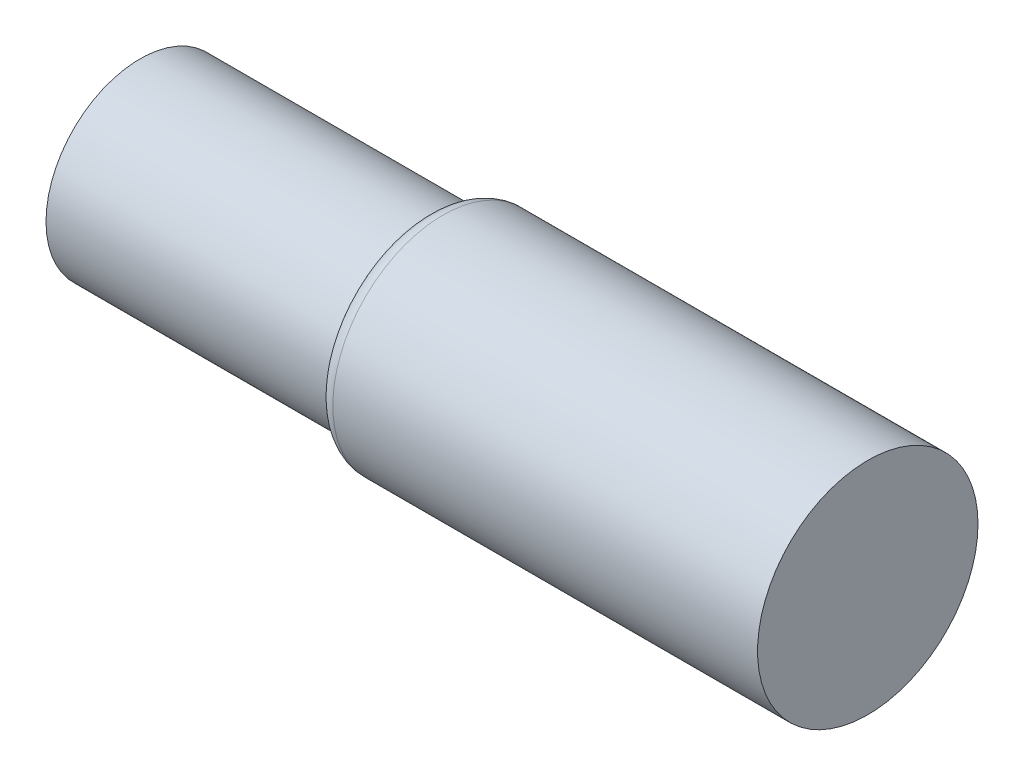
ISO-10303-21;
HEADER;
FILE_DESCRIPTION(('STEP AP214'),'2;1');
FILE_NAME('part.step','',(''),(''),'','','');
FILE_SCHEMA(('AUTOMOTIVE_DESIGN { 1 0 10303 214 1 1 1 1 }'));
ENDSEC;
DATA;
#1=APPLICATION_CONTEXT('core data for automotive mechanical design processes');
#2=APPLICATION_PROTOCOL_DEFINITION('international standard','automotive_design',2000,#1);
#3=PRODUCT_CONTEXT('',#1,'mechanical');
#4=PRODUCT('Part','Part','',(#3));
#5=PRODUCT_RELATED_PRODUCT_CATEGORY('part','',(#4));
#6=PRODUCT_DEFINITION_FORMATION('','',#4);
#7=PRODUCT_DEFINITION_CONTEXT('part definition',#1,'design');
#8=PRODUCT_DEFINITION('design','',#6,#7);
#9=PRODUCT_DEFINITION_SHAPE('','',#8);
#10=(LENGTH_UNIT() NAMED_UNIT(*) SI_UNIT(.MILLI.,.METRE.));
#11=(NAMED_UNIT(*) PLANE_ANGLE_UNIT() SI_UNIT($,.RADIAN.));
#12=(NAMED_UNIT(*) SI_UNIT($,.STERADIAN.) SOLID_ANGLE_UNIT());
#13=UNCERTAINTY_MEASURE_WITH_UNIT(LENGTH_MEASURE(1.E-05),#10,'distance_accuracy_value','');
#14=(GEOMETRIC_REPRESENTATION_CONTEXT(3) GLOBAL_UNCERTAINTY_ASSIGNED_CONTEXT((#13)) GLOBAL_UNIT_ASSIGNED_CONTEXT((#10,
#11,#12)) REPRESENTATION_CONTEXT('',''));
#15=CARTESIAN_POINT('',(0.,0.,0.));
#16=DIRECTION('',(0.,0.,1.));
#17=DIRECTION('',(1.,0.,0.));
#18=AXIS2_PLACEMENT_3D('',#15,#16,#17);
#19=CARTESIAN_POINT('',(48.8,0.,0.));
#20=DIRECTION('',(-1.,0.,0.));
#21=DIRECTION('',(0.,0.,1.));
#22=AXIS2_PLACEMENT_3D('',#19,#20,#21);
#23=CYLINDRICAL_SURFACE('',#22,16.);
#24=CARTESIAN_POINT('',(48.8,0.,0.));
#25=DIRECTION('',(1.,0.,0.));
#26=DIRECTION('',(0.,0.,-1.));
#27=AXIS2_PLACEMENT_3D('',#24,#25,#26);
#28=CIRCLE('',#27,16.);
#29=CARTESIAN_POINT('',(48.8,0.,-16.));
#30=VERTEX_POINT('',#29);
#31=EDGE_CURVE('E45',#30,#30,#28,.T.);
#32=ORIENTED_EDGE('',*,*,#31,.F.);
#33=EDGE_LOOP('',(#32));
#34=FACE_BOUND('',#33,.T.);
#35=CARTESIAN_POINT('',(0.,0.,0.));
#36=DIRECTION('',(1.,0.,0.));
#37=DIRECTION('',(0.,0.,-1.));
#38=AXIS2_PLACEMENT_3D('',#35,#36,#37);
#39=CIRCLE('',#38,16.);
#40=CARTESIAN_POINT('',(0.,0.,-16.));
#41=VERTEX_POINT('',#40);
#42=EDGE_CURVE('E49',#41,#41,#39,.T.);
#43=ORIENTED_EDGE('',*,*,#42,.T.);
#44=EDGE_LOOP('',(#43));
#45=FACE_BOUND('',#44,.T.);
#46=ADVANCED_FACE('F34',(#34,#45),#23,.T.);
#47=CARTESIAN_POINT('',(0.,0.,0.));
#48=DIRECTION('',(1.,0.,0.));
#49=DIRECTION('',(0.,0.,-1.));
#50=AXIS2_PLACEMENT_3D('',#47,#48,#49);
#51=PLANE('',#50);
#52=CARTESIAN_POINT('',(0.,-8.,-8.));
#53=DIRECTION('',(-1.,0.,0.));
#54=DIRECTION('',(0.,0.,-1.));
#55=AXIS2_PLACEMENT_3D('',#52,#53,#54);
#56=CIRCLE('',#55,2.);
#57=CARTESIAN_POINT('',(0.,-8.,-10.));
#58=VERTEX_POINT('',#57);
#59=EDGE_CURVE('E70',#58,#58,#56,.T.);
#60=ORIENTED_EDGE('',*,*,#59,.F.);
#61=EDGE_LOOP('',(#60));
#62=FACE_BOUND('',#61,.T.);
#63=CARTESIAN_POINT('',(0.,-8.,8.));
#64=DIRECTION('',(-1.,0.,0.));
#65=DIRECTION('',(0.,0.,1.));
#66=AXIS2_PLACEMENT_3D('',#63,#64,#65);
#67=CIRCLE('',#66,2.);
#68=CARTESIAN_POINT('',(0.,-8.,10.));
#69=VERTEX_POINT('',#68);
#70=EDGE_CURVE('E76',#69,#69,#67,.T.);
#71=ORIENTED_EDGE('',*,*,#70,.F.);
#72=EDGE_LOOP('',(#71));
#73=FACE_BOUND('',#72,.T.);
#74=CARTESIAN_POINT('',(0.,8.,8.));
#75=DIRECTION('',(-1.,0.,0.));
#76=DIRECTION('',(0.,0.,-1.));
#77=AXIS2_PLACEMENT_3D('',#74,#75,#76);
#78=CIRCLE('',#77,2.);
#79=CARTESIAN_POINT('',(0.,8.,6.));
#80=VERTEX_POINT('',#79);
#81=EDGE_CURVE('E82',#80,#80,#78,.T.);
#82=ORIENTED_EDGE('',*,*,#81,.F.);
#83=EDGE_LOOP('',(#82));
#84=FACE_BOUND('',#83,.T.);
#85=CARTESIAN_POINT('',(0.,8.,-8.));
#86=DIRECTION('',(-1.,0.,0.));
#87=DIRECTION('',(0.,0.,1.));
#88=AXIS2_PLACEMENT_3D('',#85,#86,#87);
#89=CIRCLE('',#88,2.);
#90=CARTESIAN_POINT('',(0.,8.,-6.));
#91=VERTEX_POINT('',#90);
#92=EDGE_CURVE('E64',#91,#91,#89,.T.);
#93=ORIENTED_EDGE('',*,*,#92,.F.);
#94=EDGE_LOOP('',(#93));
#95=FACE_BOUND('',#94,.T.);
#96=CARTESIAN_POINT('',(0.,0.,0.));
#97=DIRECTION('',(-1.,0.,0.));
#98=DIRECTION('',(0.,0.,1.));
#99=AXIS2_PLACEMENT_3D('',#96,#97,#98);
#100=CIRCLE('',#99,3.);
#101=CARTESIAN_POINT('',(0.,0.,3.));
#102=VERTEX_POINT('',#101);
#103=EDGE_CURVE('E58',#102,#102,#100,.T.);
#104=ORIENTED_EDGE('',*,*,#103,.F.);
#105=EDGE_LOOP('',(#104));
#106=FACE_BOUND('',#105,.T.);
#107=ORIENTED_EDGE('',*,*,#42,.F.);
#108=EDGE_LOOP('',(#107));
#109=FACE_BOUND('',#108,.T.);
#110=ADVANCED_FACE('F97',(#62,#73,#84,#95,#106,#109),#51,.F.);
#111=CARTESIAN_POINT('',(123.8,0.,0.));
#112=DIRECTION('',(-1.,0.,0.));
#113=DIRECTION('',(0.,0.,1.));
#114=AXIS2_PLACEMENT_3D('',#111,#112,#113);
#115=CYLINDRICAL_SURFACE('',#114,18.75);
#116=CARTESIAN_POINT('',(51.54,0.,0.));
#117=DIRECTION('',(1.,0.,0.));
#118=DIRECTION('',(0.,0.,-1.));
#119=AXIS2_PLACEMENT_3D('',#116,#117,#118);
#120=CIRCLE('',#119,18.75);
#121=CARTESIAN_POINT('',(51.54,0.,-18.75));
#122=VERTEX_POINT('',#121);
#123=EDGE_CURVE('E41',#122,#122,#120,.T.);
#124=ORIENTED_EDGE('',*,*,#123,.T.);
#125=EDGE_LOOP('',(#124));
#126=FACE_BOUND('',#125,.T.);
#127=CARTESIAN_POINT('',(123.8,0.,0.));
#128=DIRECTION('',(1.,0.,0.));
#129=DIRECTION('',(0.,0.,-1.));
#130=AXIS2_PLACEMENT_3D('',#127,#128,#129);
#131=CIRCLE('',#130,18.75);
#132=CARTESIAN_POINT('',(123.8,0.,-18.75));
#133=VERTEX_POINT('',#132);
#134=EDGE_CURVE('E53',#133,#133,#131,.T.);
#135=ORIENTED_EDGE('',*,*,#134,.F.);
#136=EDGE_LOOP('',(#135));
#137=FACE_BOUND('',#136,.T.);
#138=ADVANCED_FACE('F100',(#126,#137),#115,.T.);
#139=CARTESIAN_POINT('',(123.8,0.,0.));
#140=DIRECTION('',(1.,0.,0.));
#141=DIRECTION('',(0.,0.,-1.));
#142=AXIS2_PLACEMENT_3D('',#139,#140,#141);
#143=PLANE('',#142);
#144=ORIENTED_EDGE('',*,*,#134,.T.);
#145=EDGE_LOOP('',(#144));
#146=FACE_BOUND('',#145,.T.);
#147=ADVANCED_FACE('F117',(#146),#143,.T.);
#148=CARTESIAN_POINT('',(48.8,0.,0.));
#149=DIRECTION('',(1.,0.,0.));
#150=DIRECTION('',(0.,0.,-1.));
#151=AXIS2_PLACEMENT_3D('',#148,#149,#150);
#152=PLANE('',#151);
#153=CARTESIAN_POINT('',(48.8,0.,0.));
#154=DIRECTION('',(1.,0.,0.));
#155=DIRECTION('',(0.,0.,-1.));
#156=AXIS2_PLACEMENT_3D('',#153,#154,#155);
#157=CIRCLE('',#156,16.01);
#158=CARTESIAN_POINT('',(48.8,0.,-16.01));
#159=VERTEX_POINT('',#158);
#160=EDGE_CURVE('E10',#159,#159,#157,.F.);
#161=ORIENTED_EDGE('',*,*,#160,.T.);
#162=EDGE_LOOP('',(#161));
#163=FACE_BOUND('',#162,.T.);
#164=ORIENTED_EDGE('',*,*,#31,.T.);
#165=EDGE_LOOP('',(#164));
#166=FACE_BOUND('',#165,.T.);
#167=ADVANCED_FACE('F118',(#163,#166),#152,.F.);
#168=CARTESIAN_POINT('',(51.54,0.,0.));
#169=DIRECTION('',(1.,0.,0.));
#170=DIRECTION('',(0.,0.,-1.));
#171=AXIS2_PLACEMENT_3D('',#168,#169,#170);
#172=TOROIDAL_SURFACE('',#171,16.01,2.74);
#173=ORIENTED_EDGE('',*,*,#160,.F.);
#174=EDGE_LOOP('',(#173));
#175=FACE_BOUND('',#174,.T.);
#176=ORIENTED_EDGE('',*,*,#123,.F.);
#177=EDGE_LOOP('',(#176));
#178=FACE_BOUND('',#177,.T.);
#179=ADVANCED_FACE('F36',(#175,#178),#172,.T.);
#180=CARTESIAN_POINT('',(2.,0.,0.));
#181=DIRECTION('',(-1.,0.,0.));
#182=DIRECTION('',(0.,0.,1.));
#183=AXIS2_PLACEMENT_3D('',#180,#181,#182);
#184=CYLINDRICAL_SURFACE('',#183,3.);
#185=CARTESIAN_POINT('',(2.,0.,0.));
#186=DIRECTION('',(-1.,0.,0.));
#187=DIRECTION('',(0.,0.,1.));
#188=AXIS2_PLACEMENT_3D('',#185,#186,#187);
#189=CIRCLE('',#188,3.);
#190=CARTESIAN_POINT('',(2.,0.,3.));
#191=VERTEX_POINT('',#190);
#192=EDGE_CURVE('E57',#191,#191,#189,.T.);
#193=ORIENTED_EDGE('',*,*,#192,.F.);
#194=EDGE_LOOP('',(#193));
#195=FACE_BOUND('',#194,.T.);
#196=ORIENTED_EDGE('',*,*,#103,.T.);
#197=EDGE_LOOP('',(#196));
#198=FACE_BOUND('',#197,.T.);
#199=ADVANCED_FACE('F124',(#195,#198),#184,.F.);
#200=CARTESIAN_POINT('',(2.,0.,0.));
#201=DIRECTION('',(-1.,0.,0.));
#202=DIRECTION('',(0.,0.,1.));
#203=AXIS2_PLACEMENT_3D('',#200,#201,#202);
#204=PLANE('',#203);
#205=ORIENTED_EDGE('',*,*,#192,.T.);
#206=EDGE_LOOP('',(#205));
#207=FACE_BOUND('',#206,.T.);
#208=ADVANCED_FACE('F127',(#207),#204,.T.);
#209=CARTESIAN_POINT('',(10.,8.,-8.));
#210=DIRECTION('',(-1.,0.,0.));
#211=DIRECTION('',(0.,0.,1.));
#212=AXIS2_PLACEMENT_3D('',#209,#210,#211);
#213=CYLINDRICAL_SURFACE('',#212,2.);
#214=CARTESIAN_POINT('',(10.,8.,-8.));
#215=DIRECTION('',(-1.,0.,0.));
#216=DIRECTION('',(0.,0.,1.));
#217=AXIS2_PLACEMENT_3D('',#214,#215,#216);
#218=CIRCLE('',#217,2.);
#219=CARTESIAN_POINT('',(10.,8.,-6.));
#220=VERTEX_POINT('',#219);
#221=EDGE_CURVE('E61',#220,#220,#218,.T.);
#222=ORIENTED_EDGE('',*,*,#221,.F.);
#223=EDGE_LOOP('',(#222));
#224=FACE_BOUND('',#223,.T.);
#225=ORIENTED_EDGE('',*,*,#92,.T.);
#226=EDGE_LOOP('',(#225));
#227=FACE_BOUND('',#226,.T.);
#228=ADVANCED_FACE('F131',(#224,#227),#213,.F.);
#229=CARTESIAN_POINT('',(10.,8.,-8.));
#230=DIRECTION('',(-1.,0.,0.));
#231=DIRECTION('',(0.,0.,1.));
#232=AXIS2_PLACEMENT_3D('',#229,#230,#231);
#233=PLANE('',#232);
#234=ORIENTED_EDGE('',*,*,#221,.T.);
#235=EDGE_LOOP('',(#234));
#236=FACE_BOUND('',#235,.T.);
#237=ADVANCED_FACE('F93',(#236),#233,.T.);
#238=CARTESIAN_POINT('',(10.,8.,8.));
#239=DIRECTION('',(-1.,0.,0.));
#240=DIRECTION('',(0.,0.,1.));
#241=AXIS2_PLACEMENT_3D('',#238,#239,#240);
#242=CYLINDRICAL_SURFACE('',#241,2.);
#243=CARTESIAN_POINT('',(10.,8.,8.));
#244=DIRECTION('',(-1.,0.,0.));
#245=DIRECTION('',(0.,0.,-1.));
#246=AXIS2_PLACEMENT_3D('',#243,#244,#245);
#247=CIRCLE('',#246,2.);
#248=CARTESIAN_POINT('',(10.,8.,6.));
#249=VERTEX_POINT('',#248);
#250=EDGE_CURVE('E67',#249,#249,#247,.T.);
#251=ORIENTED_EDGE('',*,*,#250,.F.);
#252=EDGE_LOOP('',(#251));
#253=FACE_BOUND('',#252,.T.);
#254=ORIENTED_EDGE('',*,*,#81,.T.);
#255=EDGE_LOOP('',(#254));
#256=FACE_BOUND('',#255,.T.);
#257=ADVANCED_FACE('F90',(#253,#256),#242,.F.);
#258=CARTESIAN_POINT('',(10.,8.,8.));
#259=DIRECTION('',(1.,0.,0.));
#260=DIRECTION('',(0.,0.,-1.));
#261=AXIS2_PLACEMENT_3D('',#258,#259,#260);
#262=PLANE('',#261);
#263=ORIENTED_EDGE('',*,*,#250,.T.);
#264=EDGE_LOOP('',(#263));
#265=FACE_BOUND('',#264,.T.);
#266=ADVANCED_FACE('F88',(#265),#262,.F.);
#267=CARTESIAN_POINT('',(10.,-8.,8.));
#268=DIRECTION('',(-1.,0.,0.));
#269=DIRECTION('',(0.,0.,1.));
#270=AXIS2_PLACEMENT_3D('',#267,#268,#269);
#271=CYLINDRICAL_SURFACE('',#270,2.);
#272=CARTESIAN_POINT('',(10.,-8.,8.));
#273=DIRECTION('',(-1.,0.,0.));
#274=DIRECTION('',(0.,0.,1.));
#275=AXIS2_PLACEMENT_3D('',#272,#273,#274);
#276=CIRCLE('',#275,2.);
#277=CARTESIAN_POINT('',(10.,-8.,10.));
#278=VERTEX_POINT('',#277);
#279=EDGE_CURVE('E79',#278,#278,#276,.T.);
#280=ORIENTED_EDGE('',*,*,#279,.F.);
#281=EDGE_LOOP('',(#280));
#282=FACE_BOUND('',#281,.T.);
#283=ORIENTED_EDGE('',*,*,#70,.T.);
#284=EDGE_LOOP('',(#283));
#285=FACE_BOUND('',#284,.T.);
#286=ADVANCED_FACE('F148',(#282,#285),#271,.F.);
#287=CARTESIAN_POINT('',(10.,-8.,8.));
#288=DIRECTION('',(-1.,0.,0.));
#289=DIRECTION('',(0.,0.,1.));
#290=AXIS2_PLACEMENT_3D('',#287,#288,#289);
#291=PLANE('',#290);
#292=ORIENTED_EDGE('',*,*,#279,.T.);
#293=EDGE_LOOP('',(#292));
#294=FACE_BOUND('',#293,.T.);
#295=ADVANCED_FACE('F143',(#294),#291,.T.);
#296=CARTESIAN_POINT('',(10.,-8.,-8.));
#297=DIRECTION('',(-1.,0.,0.));
#298=DIRECTION('',(0.,0.,1.));
#299=AXIS2_PLACEMENT_3D('',#296,#297,#298);
#300=CYLINDRICAL_SURFACE('',#299,2.);
#301=CARTESIAN_POINT('',(10.,-8.,-8.));
#302=DIRECTION('',(-1.,0.,0.));
#303=DIRECTION('',(0.,0.,-1.));
#304=AXIS2_PLACEMENT_3D('',#301,#302,#303);
#305=CIRCLE('',#304,2.);
#306=CARTESIAN_POINT('',(10.,-8.,-10.));
#307=VERTEX_POINT('',#306);
#308=EDGE_CURVE('E73',#307,#307,#305,.T.);
#309=ORIENTED_EDGE('',*,*,#308,.F.);
#310=EDGE_LOOP('',(#309));
#311=FACE_BOUND('',#310,.T.);
#312=ORIENTED_EDGE('',*,*,#59,.T.);
#313=EDGE_LOOP('',(#312));
#314=FACE_BOUND('',#313,.T.);
#315=ADVANCED_FACE('F139',(#311,#314),#300,.F.);
#316=CARTESIAN_POINT('',(10.,-8.,-8.));
#317=DIRECTION('',(1.,0.,0.));
#318=DIRECTION('',(0.,0.,-1.));
#319=AXIS2_PLACEMENT_3D('',#316,#317,#318);
#320=PLANE('',#319);
#321=ORIENTED_EDGE('',*,*,#308,.T.);
#322=EDGE_LOOP('',(#321));
#323=FACE_BOUND('',#322,.T.);
#324=ADVANCED_FACE('F142',(#323),#320,.F.);
#325=CLOSED_SHELL('',(#46,#110,#138,#147,#167,#179,#199,#208,#228,#237,#257,#266,#286,#295,#315,#324));
#326=MANIFOLD_SOLID_BREP('B2',#325);
#327=ADVANCED_BREP_SHAPE_REPRESENTATION('',(#18,#326),#14);
#328=SHAPE_DEFINITION_REPRESENTATION(#9,#327);
ENDSEC;
END-ISO-10303-21;
